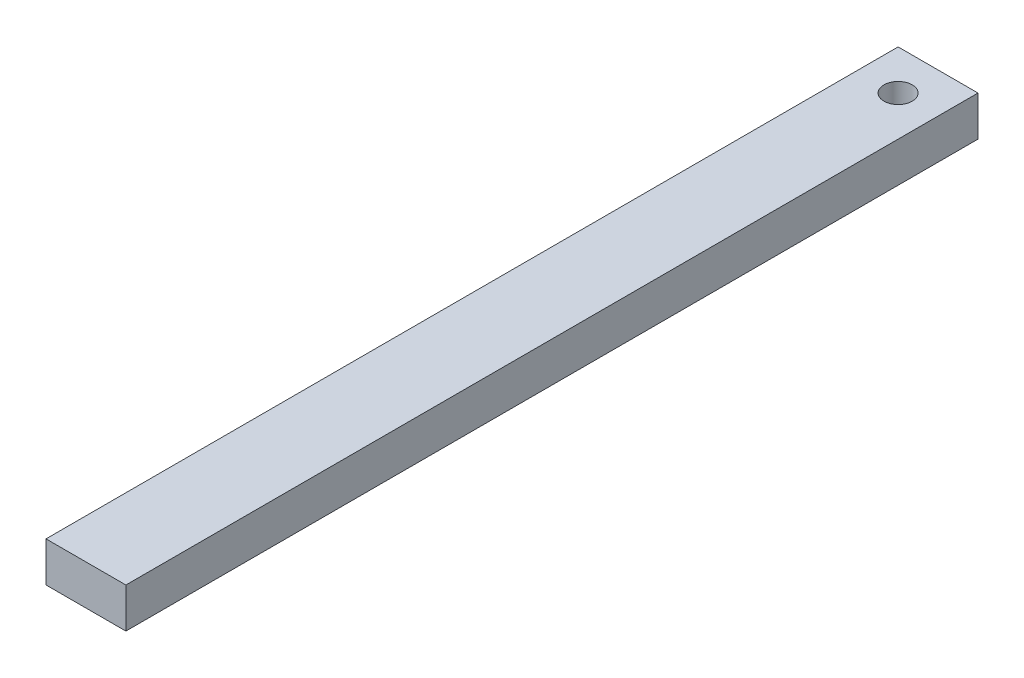
ISO-10303-21;
HEADER;
FILE_DESCRIPTION(('STEP AP214'),'2;1');
FILE_NAME('part.step','',(''),(''),'','','');
FILE_SCHEMA(('AUTOMOTIVE_DESIGN { 1 0 10303 214 1 1 1 1 }'));
ENDSEC;
DATA;
#1=APPLICATION_CONTEXT('core data for automotive mechanical design processes');
#2=APPLICATION_PROTOCOL_DEFINITION('international standard','automotive_design',2000,#1);
#3=PRODUCT_CONTEXT('',#1,'mechanical');
#4=PRODUCT('Part','Part','',(#3));
#5=PRODUCT_RELATED_PRODUCT_CATEGORY('part','',(#4));
#6=PRODUCT_DEFINITION_FORMATION('','',#4);
#7=PRODUCT_DEFINITION_CONTEXT('part definition',#1,'design');
#8=PRODUCT_DEFINITION('design','',#6,#7);
#9=PRODUCT_DEFINITION_SHAPE('','',#8);
#10=(LENGTH_UNIT() NAMED_UNIT(*) SI_UNIT(.MILLI.,.METRE.));
#11=(NAMED_UNIT(*) PLANE_ANGLE_UNIT() SI_UNIT($,.RADIAN.));
#12=(NAMED_UNIT(*) SI_UNIT($,.STERADIAN.) SOLID_ANGLE_UNIT());
#13=UNCERTAINTY_MEASURE_WITH_UNIT(LENGTH_MEASURE(1.E-05),#10,'distance_accuracy_value','');
#14=(GEOMETRIC_REPRESENTATION_CONTEXT(3) GLOBAL_UNCERTAINTY_ASSIGNED_CONTEXT((#13)) GLOBAL_UNIT_ASSIGNED_CONTEXT((#10,
#11,#12)) REPRESENTATION_CONTEXT('',''));
#15=CARTESIAN_POINT('',(0.,0.,0.));
#16=DIRECTION('',(0.,0.,1.));
#17=DIRECTION('',(1.,0.,0.));
#18=AXIS2_PLACEMENT_3D('',#15,#16,#17);
#19=CARTESIAN_POINT('',(9.525,-4.7625,203.2));
#20=DIRECTION('',(-1.,0.,0.));
#21=DIRECTION('',(0.,0.,1.));
#22=AXIS2_PLACEMENT_3D('',#19,#20,#21);
#23=PLANE('',#22);
#24=DIRECTION('',(0.,1.,0.));
#25=VECTOR('',#24,1.);
#26=CARTESIAN_POINT('',(9.525,-4.7625,0.));
#27=LINE('',#26,#25);
#28=CARTESIAN_POINT('',(9.525,-4.7625,0.));
#29=VERTEX_POINT('',#28);
#30=CARTESIAN_POINT('',(9.525,4.7625,0.));
#31=VERTEX_POINT('',#30);
#32=EDGE_CURVE('E99',#29,#31,#27,.T.);
#33=ORIENTED_EDGE('',*,*,#32,.T.);
#34=DIRECTION('',(0.,0.,-1.));
#35=VECTOR('',#34,1.);
#36=CARTESIAN_POINT('',(9.525,4.7625,203.2));
#37=LINE('',#36,#35);
#38=CARTESIAN_POINT('',(9.525,4.7625,203.2));
#39=VERTEX_POINT('',#38);
#40=EDGE_CURVE('E11',#39,#31,#37,.T.);
#41=ORIENTED_EDGE('',*,*,#40,.F.);
#42=DIRECTION('',(0.,1.,0.));
#43=VECTOR('',#42,1.);
#44=CARTESIAN_POINT('',(9.525,-4.7625,203.2));
#45=LINE('',#44,#43);
#46=CARTESIAN_POINT('',(9.525,-4.7625,203.2));
#47=VERTEX_POINT('',#46);
#48=EDGE_CURVE('E87',#47,#39,#45,.T.);
#49=ORIENTED_EDGE('',*,*,#48,.F.);
#50=DIRECTION('',(0.,0.,-1.));
#51=VECTOR('',#50,1.);
#52=CARTESIAN_POINT('',(9.525,-4.7625,203.2));
#53=LINE('',#52,#51);
#54=EDGE_CURVE('E95',#47,#29,#53,.T.);
#55=ORIENTED_EDGE('',*,*,#54,.T.);
#56=EDGE_LOOP('',(#33,#41,#49,#55));
#57=FACE_BOUND('',#56,.T.);
#58=ADVANCED_FACE('F36',(#57),#23,.F.);
#59=CARTESIAN_POINT('',(-9.525,4.7625,203.2));
#60=DIRECTION('',(0.,-1.,0.));
#61=DIRECTION('',(0.,0.,-1.));
#62=AXIS2_PLACEMENT_3D('',#59,#60,#61);
#63=PLANE('',#62);
#64=CARTESIAN_POINT('',(0.,4.7625,9.525));
#65=DIRECTION('',(0.,1.,0.));
#66=DIRECTION('',(0.,0.,1.));
#67=AXIS2_PLACEMENT_3D('',#64,#65,#66);
#68=CIRCLE('',#67,3.3782);
#69=CARTESIAN_POINT('',(0.,4.7625,12.9032));
#70=VERTEX_POINT('',#69);
#71=EDGE_CURVE('E115',#70,#70,#68,.T.);
#72=ORIENTED_EDGE('',*,*,#71,.F.);
#73=EDGE_LOOP('',(#72));
#74=FACE_BOUND('',#73,.T.);
#75=DIRECTION('',(-1.,0.,0.));
#76=VECTOR('',#75,1.);
#77=CARTESIAN_POINT('',(-9.525,4.7625,0.));
#78=LINE('',#77,#76);
#79=CARTESIAN_POINT('',(-9.525,4.7625,0.));
#80=VERTEX_POINT('',#79);
#81=EDGE_CURVE('E91',#31,#80,#78,.T.);
#82=ORIENTED_EDGE('',*,*,#81,.T.);
#83=DIRECTION('',(0.,0.,-1.));
#84=VECTOR('',#83,1.);
#85=CARTESIAN_POINT('',(-9.525,4.7625,203.2));
#86=LINE('',#85,#84);
#87=CARTESIAN_POINT('',(-9.525,4.7625,203.2));
#88=VERTEX_POINT('',#87);
#89=EDGE_CURVE('E44',#88,#80,#86,.T.);
#90=ORIENTED_EDGE('',*,*,#89,.F.);
#91=DIRECTION('',(-1.,0.,0.));
#92=VECTOR('',#91,1.);
#93=CARTESIAN_POINT('',(-9.525,4.7625,203.2));
#94=LINE('',#93,#92);
#95=EDGE_CURVE('E82',#39,#88,#94,.T.);
#96=ORIENTED_EDGE('',*,*,#95,.F.);
#97=ORIENTED_EDGE('',*,*,#40,.T.);
#98=EDGE_LOOP('',(#82,#90,#96,#97));
#99=FACE_BOUND('',#98,.T.);
#100=ADVANCED_FACE('F90',(#74,#99),#63,.F.);
#101=CARTESIAN_POINT('',(-9.525,-4.7625,203.2));
#102=DIRECTION('',(1.,0.,0.));
#103=DIRECTION('',(0.,0.,-1.));
#104=AXIS2_PLACEMENT_3D('',#101,#102,#103);
#105=PLANE('',#104);
#106=DIRECTION('',(0.,-1.,0.));
#107=VECTOR('',#106,1.);
#108=CARTESIAN_POINT('',(-9.525,-4.7625,0.));
#109=LINE('',#108,#107);
#110=CARTESIAN_POINT('',(-9.525,-4.7625,0.));
#111=VERTEX_POINT('',#110);
#112=EDGE_CURVE('E69',#80,#111,#109,.T.);
#113=ORIENTED_EDGE('',*,*,#112,.T.);
#114=DIRECTION('',(0.,0.,-1.));
#115=VECTOR('',#114,1.);
#116=CARTESIAN_POINT('',(-9.525,-4.7625,203.2));
#117=LINE('',#116,#115);
#118=CARTESIAN_POINT('',(-9.525,-4.7625,203.2));
#119=VERTEX_POINT('',#118);
#120=EDGE_CURVE('E92',#119,#111,#117,.T.);
#121=ORIENTED_EDGE('',*,*,#120,.F.);
#122=DIRECTION('',(0.,-1.,0.));
#123=VECTOR('',#122,1.);
#124=CARTESIAN_POINT('',(-9.525,-4.7625,203.2));
#125=LINE('',#124,#123);
#126=EDGE_CURVE('E85',#88,#119,#125,.T.);
#127=ORIENTED_EDGE('',*,*,#126,.F.);
#128=ORIENTED_EDGE('',*,*,#89,.T.);
#129=EDGE_LOOP('',(#113,#121,#127,#128));
#130=FACE_BOUND('',#129,.T.);
#131=ADVANCED_FACE('F93',(#130),#105,.F.);
#132=CARTESIAN_POINT('',(-9.525,-4.7625,203.2));
#133=DIRECTION('',(0.,1.,0.));
#134=DIRECTION('',(0.,0.,1.));
#135=AXIS2_PLACEMENT_3D('',#132,#133,#134);
#136=PLANE('',#135);
#137=CARTESIAN_POINT('',(0.,-4.7625,9.525));
#138=DIRECTION('',(0.,1.,0.));
#139=DIRECTION('',(0.,0.,1.));
#140=AXIS2_PLACEMENT_3D('',#137,#138,#139);
#141=CIRCLE('',#140,3.3782);
#142=CARTESIAN_POINT('',(0.,-4.7625,12.9032));
#143=VERTEX_POINT('',#142);
#144=EDGE_CURVE('E102',#143,#143,#141,.T.);
#145=ORIENTED_EDGE('',*,*,#144,.T.);
#146=EDGE_LOOP('',(#145));
#147=FACE_BOUND('',#146,.T.);
#148=DIRECTION('',(1.,0.,0.));
#149=VECTOR('',#148,1.);
#150=CARTESIAN_POINT('',(-9.525,-4.7625,0.));
#151=LINE('',#150,#149);
#152=EDGE_CURVE('E75',#111,#29,#151,.T.);
#153=ORIENTED_EDGE('',*,*,#152,.T.);
#154=ORIENTED_EDGE('',*,*,#54,.F.);
#155=DIRECTION('',(1.,0.,0.));
#156=VECTOR('',#155,1.);
#157=CARTESIAN_POINT('',(-9.525,-4.7625,203.2));
#158=LINE('',#157,#156);
#159=EDGE_CURVE('E52',#119,#47,#158,.T.);
#160=ORIENTED_EDGE('',*,*,#159,.F.);
#161=ORIENTED_EDGE('',*,*,#120,.T.);
#162=EDGE_LOOP('',(#153,#154,#160,#161));
#163=FACE_BOUND('',#162,.T.);
#164=ADVANCED_FACE('F107',(#147,#163),#136,.F.);
#165=CARTESIAN_POINT('',(0.,0.,203.2));
#166=DIRECTION('',(0.,0.,-1.));
#167=DIRECTION('',(-1.,0.,0.));
#168=AXIS2_PLACEMENT_3D('',#165,#166,#167);
#169=PLANE('',#168);
#170=ORIENTED_EDGE('',*,*,#48,.T.);
#171=ORIENTED_EDGE('',*,*,#95,.T.);
#172=ORIENTED_EDGE('',*,*,#126,.T.);
#173=ORIENTED_EDGE('',*,*,#159,.T.);
#174=EDGE_LOOP('',(#170,#171,#172,#173));
#175=FACE_BOUND('',#174,.T.);
#176=ADVANCED_FACE('F83',(#175),#169,.F.);
#177=CARTESIAN_POINT('',(0.,0.,0.));
#178=DIRECTION('',(0.,0.,-1.));
#179=DIRECTION('',(-1.,0.,0.));
#180=AXIS2_PLACEMENT_3D('',#177,#178,#179);
#181=PLANE('',#180);
#182=ORIENTED_EDGE('',*,*,#32,.F.);
#183=ORIENTED_EDGE('',*,*,#152,.F.);
#184=ORIENTED_EDGE('',*,*,#112,.F.);
#185=ORIENTED_EDGE('',*,*,#81,.F.);
#186=EDGE_LOOP('',(#182,#183,#184,#185));
#187=FACE_BOUND('',#186,.T.);
#188=ADVANCED_FACE('F110',(#187),#181,.T.);
#189=CARTESIAN_POINT('',(0.,4.7625,9.525));
#190=DIRECTION('',(0.,1.,0.));
#191=DIRECTION('',(0.,0.,1.));
#192=AXIS2_PLACEMENT_3D('',#189,#190,#191);
#193=CYLINDRICAL_SURFACE('',#192,3.3782);
#194=ORIENTED_EDGE('',*,*,#144,.F.);
#195=EDGE_LOOP('',(#194));
#196=FACE_BOUND('',#195,.T.);
#197=ORIENTED_EDGE('',*,*,#71,.T.);
#198=EDGE_LOOP('',(#197));
#199=FACE_BOUND('',#198,.T.);
#200=ADVANCED_FACE('F119',(#196,#199),#193,.F.);
#201=CLOSED_SHELL('',(#58,#100,#131,#164,#176,#188,#200));
#202=MANIFOLD_SOLID_BREP('B2',#201);
#203=ADVANCED_BREP_SHAPE_REPRESENTATION('',(#18,#202),#14);
#204=SHAPE_DEFINITION_REPRESENTATION(#9,#203);
ENDSEC;
END-ISO-10303-21;
